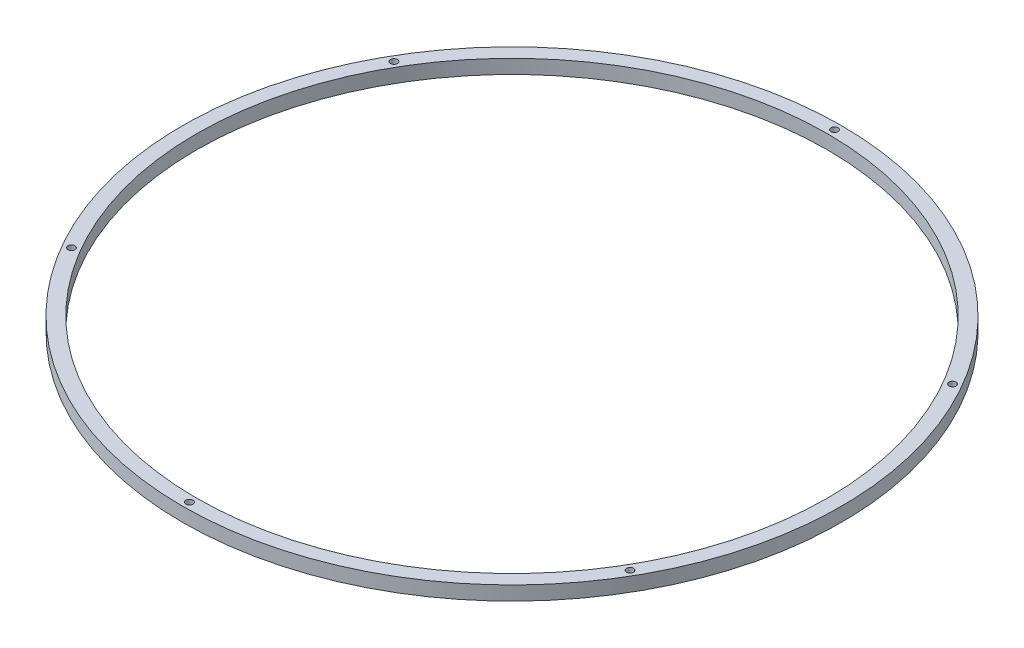
ISO-10303-21;
HEADER;
FILE_DESCRIPTION(('STEP AP214'),'2;1');
FILE_NAME('part.step','',(''),(''),'','','');
FILE_SCHEMA(('AUTOMOTIVE_DESIGN { 1 0 10303 214 1 1 1 1 }'));
ENDSEC;
DATA;
#1=APPLICATION_CONTEXT('core data for automotive mechanical design processes');
#2=APPLICATION_PROTOCOL_DEFINITION('international standard','automotive_design',2000,#1);
#3=PRODUCT_CONTEXT('',#1,'mechanical');
#4=PRODUCT('Part','Part','',(#3));
#5=PRODUCT_RELATED_PRODUCT_CATEGORY('part','',(#4));
#6=PRODUCT_DEFINITION_FORMATION('','',#4);
#7=PRODUCT_DEFINITION_CONTEXT('part definition',#1,'design');
#8=PRODUCT_DEFINITION('design','',#6,#7);
#9=PRODUCT_DEFINITION_SHAPE('','',#8);
#10=(LENGTH_UNIT() NAMED_UNIT(*) SI_UNIT(.MILLI.,.METRE.));
#11=(NAMED_UNIT(*) PLANE_ANGLE_UNIT() SI_UNIT($,.RADIAN.));
#12=(NAMED_UNIT(*) SI_UNIT($,.STERADIAN.) SOLID_ANGLE_UNIT());
#13=UNCERTAINTY_MEASURE_WITH_UNIT(LENGTH_MEASURE(1.E-05),#10,'distance_accuracy_value','');
#14=(GEOMETRIC_REPRESENTATION_CONTEXT(3) GLOBAL_UNCERTAINTY_ASSIGNED_CONTEXT((#13)) GLOBAL_UNIT_ASSIGNED_CONTEXT((#10,
#11,#12)) REPRESENTATION_CONTEXT('',''));
#15=CARTESIAN_POINT('',(0.,0.,0.));
#16=DIRECTION('',(0.,0.,1.));
#17=DIRECTION('',(1.,0.,0.));
#18=AXIS2_PLACEMENT_3D('',#15,#16,#17);
#19=CARTESIAN_POINT('',(0.,10.,0.));
#20=DIRECTION('',(0.,-1.,0.));
#21=DIRECTION('',(0.,0.,-1.));
#22=AXIS2_PLACEMENT_3D('',#19,#20,#21);
#23=CYLINDRICAL_SURFACE('',#22,225.);
#24=CARTESIAN_POINT('',(0.,10.,0.));
#25=DIRECTION('',(0.,1.,0.));
#26=DIRECTION('',(0.,0.,1.));
#27=AXIS2_PLACEMENT_3D('',#24,#25,#26);
#28=CIRCLE('',#27,225.);
#29=CARTESIAN_POINT('',(0.,10.,225.));
#30=VERTEX_POINT('',#29);
#31=EDGE_CURVE('E39',#30,#30,#28,.T.);
#32=ORIENTED_EDGE('',*,*,#31,.T.);
#33=EDGE_LOOP('',(#32));
#34=FACE_BOUND('',#33,.T.);
#35=CARTESIAN_POINT('',(0.,0.,0.));
#36=DIRECTION('',(0.,1.,0.));
#37=DIRECTION('',(0.,0.,1.));
#38=AXIS2_PLACEMENT_3D('',#35,#36,#37);
#39=CIRCLE('',#38,225.);
#40=CARTESIAN_POINT('',(0.,0.,225.));
#41=VERTEX_POINT('',#40);
#42=EDGE_CURVE('E46',#41,#41,#39,.T.);
#43=ORIENTED_EDGE('',*,*,#42,.F.);
#44=EDGE_LOOP('',(#43));
#45=FACE_BOUND('',#44,.T.);
#46=ADVANCED_FACE('F32',(#34,#45),#23,.F.);
#47=CARTESIAN_POINT('',(0.,10.,0.));
#48=DIRECTION('',(0.,-1.,0.));
#49=DIRECTION('',(0.,0.,-1.));
#50=AXIS2_PLACEMENT_3D('',#47,#48,#49);
#51=CYLINDRICAL_SURFACE('',#50,235.);
#52=CARTESIAN_POINT('',(0.,10.,0.));
#53=DIRECTION('',(0.,1.,0.));
#54=DIRECTION('',(0.,0.,1.));
#55=AXIS2_PLACEMENT_3D('',#52,#53,#54);
#56=CIRCLE('',#55,235.);
#57=CARTESIAN_POINT('',(0.,10.,235.));
#58=VERTEX_POINT('',#57);
#59=EDGE_CURVE('E10',#58,#58,#56,.T.);
#60=ORIENTED_EDGE('',*,*,#59,.F.);
#61=EDGE_LOOP('',(#60));
#62=FACE_BOUND('',#61,.T.);
#63=CARTESIAN_POINT('',(0.,0.,0.));
#64=DIRECTION('',(0.,1.,0.));
#65=DIRECTION('',(0.,0.,1.));
#66=AXIS2_PLACEMENT_3D('',#63,#64,#65);
#67=CIRCLE('',#66,235.);
#68=CARTESIAN_POINT('',(0.,0.,235.));
#69=VERTEX_POINT('',#68);
#70=EDGE_CURVE('E35',#69,#69,#67,.T.);
#71=ORIENTED_EDGE('',*,*,#70,.T.);
#72=EDGE_LOOP('',(#71));
#73=FACE_BOUND('',#72,.T.);
#74=ADVANCED_FACE('F103',(#62,#73),#51,.T.);
#75=CARTESIAN_POINT('',(0.,10.,0.));
#76=DIRECTION('',(0.,1.,0.));
#77=DIRECTION('',(0.,0.,1.));
#78=AXIS2_PLACEMENT_3D('',#75,#76,#77);
#79=PLANE('',#78);
#80=CARTESIAN_POINT('',(-199.18584287042,10.,115.000000000001));
#81=DIRECTION('',(0.,1.,0.));
#82=DIRECTION('',(0.866025403784436,0.,-0.500000000000004));
#83=AXIS2_PLACEMENT_3D('',#80,#81,#82);
#84=CIRCLE('',#83,2.5);
#85=CARTESIAN_POINT('',(-197.020779360959,10.,113.750000000001));
#86=VERTEX_POINT('',#85);
#87=EDGE_CURVE('E84',#86,#86,#84,.T.);
#88=ORIENTED_EDGE('',*,*,#87,.F.);
#89=EDGE_LOOP('',(#88));
#90=FACE_BOUND('',#89,.T.);
#91=CARTESIAN_POINT('',(0.,10.,230.));
#92=DIRECTION('',(0.,1.,0.));
#93=DIRECTION('',(0.,0.,-1.));
#94=AXIS2_PLACEMENT_3D('',#91,#92,#93);
#95=CIRCLE('',#94,2.5);
#96=CARTESIAN_POINT('',(0.,10.,227.5));
#97=VERTEX_POINT('',#96);
#98=EDGE_CURVE('E78',#97,#97,#95,.T.);
#99=ORIENTED_EDGE('',*,*,#98,.F.);
#100=EDGE_LOOP('',(#99));
#101=FACE_BOUND('',#100,.T.);
#102=CARTESIAN_POINT('',(199.185842870422,10.,114.999999999998));
#103=DIRECTION('',(0.,1.,0.));
#104=DIRECTION('',(-0.866025403784443,0.,-0.499999999999992));
#105=AXIS2_PLACEMENT_3D('',#102,#103,#104);
#106=CIRCLE('',#105,2.5);
#107=CARTESIAN_POINT('',(197.020779360961,10.,113.749999999998));
#108=VERTEX_POINT('',#107);
#109=EDGE_CURVE('E72',#108,#108,#106,.T.);
#110=ORIENTED_EDGE('',*,*,#109,.F.);
#111=EDGE_LOOP('',(#110));
#112=FACE_BOUND('',#111,.T.);
#113=CARTESIAN_POINT('',(199.18584287042,10.,-115.000000000002));
#114=DIRECTION('',(0.,1.,0.));
#115=DIRECTION('',(-0.866025403784433,0.,0.50000000000001));
#116=AXIS2_PLACEMENT_3D('',#113,#114,#115);
#117=CIRCLE('',#116,2.5);
#118=CARTESIAN_POINT('',(197.020779360958,10.,-113.750000000002));
#119=VERTEX_POINT('',#118);
#120=EDGE_CURVE('E66',#119,#119,#117,.T.);
#121=ORIENTED_EDGE('',*,*,#120,.F.);
#122=EDGE_LOOP('',(#121));
#123=FACE_BOUND('',#122,.T.);
#124=CARTESIAN_POINT('',(-199.185842870421,10.,-115.));
#125=DIRECTION('',(0.,1.,0.));
#126=DIRECTION('',(0.86602540378444,0.,0.499999999999998));
#127=AXIS2_PLACEMENT_3D('',#124,#125,#126);
#128=CIRCLE('',#127,2.5);
#129=CARTESIAN_POINT('',(-197.02077936096,10.,-113.75));
#130=VERTEX_POINT('',#129);
#131=EDGE_CURVE('E60',#130,#130,#128,.T.);
#132=ORIENTED_EDGE('',*,*,#131,.F.);
#133=EDGE_LOOP('',(#132));
#134=FACE_BOUND('',#133,.T.);
#135=CARTESIAN_POINT('',(0.,10.,-230.));
#136=DIRECTION('',(0.,1.,0.));
#137=DIRECTION('',(0.,0.,1.));
#138=AXIS2_PLACEMENT_3D('',#135,#136,#137);
#139=CIRCLE('',#138,2.5);
#140=CARTESIAN_POINT('',(0.,10.,-227.5));
#141=VERTEX_POINT('',#140);
#142=EDGE_CURVE('E53',#141,#141,#139,.T.);
#143=ORIENTED_EDGE('',*,*,#142,.F.);
#144=EDGE_LOOP('',(#143));
#145=FACE_BOUND('',#144,.T.);
#146=ORIENTED_EDGE('',*,*,#31,.F.);
#147=EDGE_LOOP('',(#146));
#148=FACE_BOUND('',#147,.T.);
#149=ORIENTED_EDGE('',*,*,#59,.T.);
#150=EDGE_LOOP('',(#149));
#151=FACE_BOUND('',#150,.T.);
#152=ADVANCED_FACE('F100',(#90,#101,#112,#123,#134,#145,#148,#151),#79,.T.);
#153=CARTESIAN_POINT('',(0.,0.,0.));
#154=DIRECTION('',(0.,1.,0.));
#155=DIRECTION('',(0.,0.,1.));
#156=AXIS2_PLACEMENT_3D('',#153,#154,#155);
#157=PLANE('',#156);
#158=CARTESIAN_POINT('',(-199.18584287042,0.,115.000000000001));
#159=DIRECTION('',(0.,1.,0.));
#160=DIRECTION('',(0.866025403784436,0.,-0.500000000000004));
#161=AXIS2_PLACEMENT_3D('',#158,#159,#160);
#162=CIRCLE('',#161,2.5);
#163=CARTESIAN_POINT('',(-197.020779360959,0.,113.750000000001));
#164=VERTEX_POINT('',#163);
#165=EDGE_CURVE('E63',#164,#164,#162,.T.);
#166=ORIENTED_EDGE('',*,*,#165,.T.);
#167=EDGE_LOOP('',(#166));
#168=FACE_BOUND('',#167,.T.);
#169=CARTESIAN_POINT('',(0.,0.,230.));
#170=DIRECTION('',(0.,1.,0.));
#171=DIRECTION('',(0.,0.,-1.));
#172=AXIS2_PLACEMENT_3D('',#169,#170,#171);
#173=CIRCLE('',#172,2.5);
#174=CARTESIAN_POINT('',(0.,0.,227.5));
#175=VERTEX_POINT('',#174);
#176=EDGE_CURVE('E81',#175,#175,#173,.T.);
#177=ORIENTED_EDGE('',*,*,#176,.T.);
#178=EDGE_LOOP('',(#177));
#179=FACE_BOUND('',#178,.T.);
#180=CARTESIAN_POINT('',(199.185842870422,0.,114.999999999998));
#181=DIRECTION('',(0.,1.,0.));
#182=DIRECTION('',(-0.866025403784443,0.,-0.499999999999992));
#183=AXIS2_PLACEMENT_3D('',#180,#181,#182);
#184=CIRCLE('',#183,2.5);
#185=CARTESIAN_POINT('',(197.020779360961,0.,113.749999999998));
#186=VERTEX_POINT('',#185);
#187=EDGE_CURVE('E75',#186,#186,#184,.T.);
#188=ORIENTED_EDGE('',*,*,#187,.T.);
#189=EDGE_LOOP('',(#188));
#190=FACE_BOUND('',#189,.T.);
#191=CARTESIAN_POINT('',(199.18584287042,0.,-115.000000000002));
#192=DIRECTION('',(0.,1.,0.));
#193=DIRECTION('',(-0.866025403784433,0.,0.50000000000001));
#194=AXIS2_PLACEMENT_3D('',#191,#192,#193);
#195=CIRCLE('',#194,2.5);
#196=CARTESIAN_POINT('',(197.020779360958,0.,-113.750000000002));
#197=VERTEX_POINT('',#196);
#198=EDGE_CURVE('E69',#197,#197,#195,.T.);
#199=ORIENTED_EDGE('',*,*,#198,.T.);
#200=EDGE_LOOP('',(#199));
#201=FACE_BOUND('',#200,.T.);
#202=CARTESIAN_POINT('',(-199.185842870421,0.,-115.));
#203=DIRECTION('',(0.,1.,0.));
#204=DIRECTION('',(0.86602540378444,0.,0.499999999999998));
#205=AXIS2_PLACEMENT_3D('',#202,#203,#204);
#206=CIRCLE('',#205,2.5);
#207=CARTESIAN_POINT('',(-197.02077936096,0.,-113.75));
#208=VERTEX_POINT('',#207);
#209=EDGE_CURVE('E58',#208,#208,#206,.T.);
#210=ORIENTED_EDGE('',*,*,#209,.T.);
#211=EDGE_LOOP('',(#210));
#212=FACE_BOUND('',#211,.T.);
#213=CARTESIAN_POINT('',(0.,0.,-230.));
#214=DIRECTION('',(0.,1.,0.));
#215=DIRECTION('',(0.,0.,1.));
#216=AXIS2_PLACEMENT_3D('',#213,#214,#215);
#217=CIRCLE('',#216,2.5);
#218=CARTESIAN_POINT('',(0.,0.,-227.5));
#219=VERTEX_POINT('',#218);
#220=EDGE_CURVE('E48',#219,#219,#217,.T.);
#221=ORIENTED_EDGE('',*,*,#220,.T.);
#222=EDGE_LOOP('',(#221));
#223=FACE_BOUND('',#222,.T.);
#224=ORIENTED_EDGE('',*,*,#42,.T.);
#225=EDGE_LOOP('',(#224));
#226=FACE_BOUND('',#225,.T.);
#227=ORIENTED_EDGE('',*,*,#70,.F.);
#228=EDGE_LOOP('',(#227));
#229=FACE_BOUND('',#228,.T.);
#230=ADVANCED_FACE('F90',(#168,#179,#190,#201,#212,#223,#226,#229),#157,.F.);
#231=CARTESIAN_POINT('',(0.,0.,-230.));
#232=DIRECTION('',(0.,1.,0.));
#233=DIRECTION('',(0.,0.,1.));
#234=AXIS2_PLACEMENT_3D('',#231,#232,#233);
#235=CYLINDRICAL_SURFACE('',#234,2.5);
#236=ORIENTED_EDGE('',*,*,#220,.F.);
#237=EDGE_LOOP('',(#236));
#238=FACE_BOUND('',#237,.T.);
#239=ORIENTED_EDGE('',*,*,#142,.T.);
#240=EDGE_LOOP('',(#239));
#241=FACE_BOUND('',#240,.T.);
#242=ADVANCED_FACE('F128',(#238,#241),#235,.F.);
#243=CARTESIAN_POINT('',(-199.185842870421,0.,-115.));
#244=DIRECTION('',(0.,1.,0.));
#245=DIRECTION('',(0.,0.,1.));
#246=AXIS2_PLACEMENT_3D('',#243,#244,#245);
#247=CYLINDRICAL_SURFACE('',#246,2.5);
#248=ORIENTED_EDGE('',*,*,#209,.F.);
#249=EDGE_LOOP('',(#248));
#250=FACE_BOUND('',#249,.T.);
#251=ORIENTED_EDGE('',*,*,#131,.T.);
#252=EDGE_LOOP('',(#251));
#253=FACE_BOUND('',#252,.T.);
#254=ADVANCED_FACE('F132',(#250,#253),#247,.F.);
#255=CARTESIAN_POINT('',(199.18584287042,0.,-115.000000000002));
#256=DIRECTION('',(0.,1.,0.));
#257=DIRECTION('',(0.,0.,1.));
#258=AXIS2_PLACEMENT_3D('',#255,#256,#257);
#259=CYLINDRICAL_SURFACE('',#258,2.5);
#260=ORIENTED_EDGE('',*,*,#198,.F.);
#261=EDGE_LOOP('',(#260));
#262=FACE_BOUND('',#261,.T.);
#263=ORIENTED_EDGE('',*,*,#120,.T.);
#264=EDGE_LOOP('',(#263));
#265=FACE_BOUND('',#264,.T.);
#266=ADVANCED_FACE('F136',(#262,#265),#259,.F.);
#267=CARTESIAN_POINT('',(199.185842870422,0.,114.999999999998));
#268=DIRECTION('',(0.,1.,0.));
#269=DIRECTION('',(0.,0.,1.));
#270=AXIS2_PLACEMENT_3D('',#267,#268,#269);
#271=CYLINDRICAL_SURFACE('',#270,2.5);
#272=ORIENTED_EDGE('',*,*,#187,.F.);
#273=EDGE_LOOP('',(#272));
#274=FACE_BOUND('',#273,.T.);
#275=ORIENTED_EDGE('',*,*,#109,.T.);
#276=EDGE_LOOP('',(#275));
#277=FACE_BOUND('',#276,.T.);
#278=ADVANCED_FACE('F140',(#274,#277),#271,.F.);
#279=CARTESIAN_POINT('',(0.,0.,230.));
#280=DIRECTION('',(0.,1.,0.));
#281=DIRECTION('',(0.,0.,1.));
#282=AXIS2_PLACEMENT_3D('',#279,#280,#281);
#283=CYLINDRICAL_SURFACE('',#282,2.5);
#284=ORIENTED_EDGE('',*,*,#176,.F.);
#285=EDGE_LOOP('',(#284));
#286=FACE_BOUND('',#285,.T.);
#287=ORIENTED_EDGE('',*,*,#98,.T.);
#288=EDGE_LOOP('',(#287));
#289=FACE_BOUND('',#288,.T.);
#290=ADVANCED_FACE('F96',(#286,#289),#283,.F.);
#291=CARTESIAN_POINT('',(-199.18584287042,0.,115.000000000001));
#292=DIRECTION('',(0.,1.,0.));
#293=DIRECTION('',(0.,0.,1.));
#294=AXIS2_PLACEMENT_3D('',#291,#292,#293);
#295=CYLINDRICAL_SURFACE('',#294,2.5);
#296=ORIENTED_EDGE('',*,*,#165,.F.);
#297=EDGE_LOOP('',(#296));
#298=FACE_BOUND('',#297,.T.);
#299=ORIENTED_EDGE('',*,*,#87,.T.);
#300=EDGE_LOOP('',(#299));
#301=FACE_BOUND('',#300,.T.);
#302=ADVANCED_FACE('F93',(#298,#301),#295,.F.);
#303=CLOSED_SHELL('',(#46,#74,#152,#230,#242,#254,#266,#278,#290,#302));
#304=MANIFOLD_SOLID_BREP('B2',#303);
#305=ADVANCED_BREP_SHAPE_REPRESENTATION('',(#18,#304),#14);
#306=SHAPE_DEFINITION_REPRESENTATION(#9,#305);
ENDSEC;
END-ISO-10303-21;
